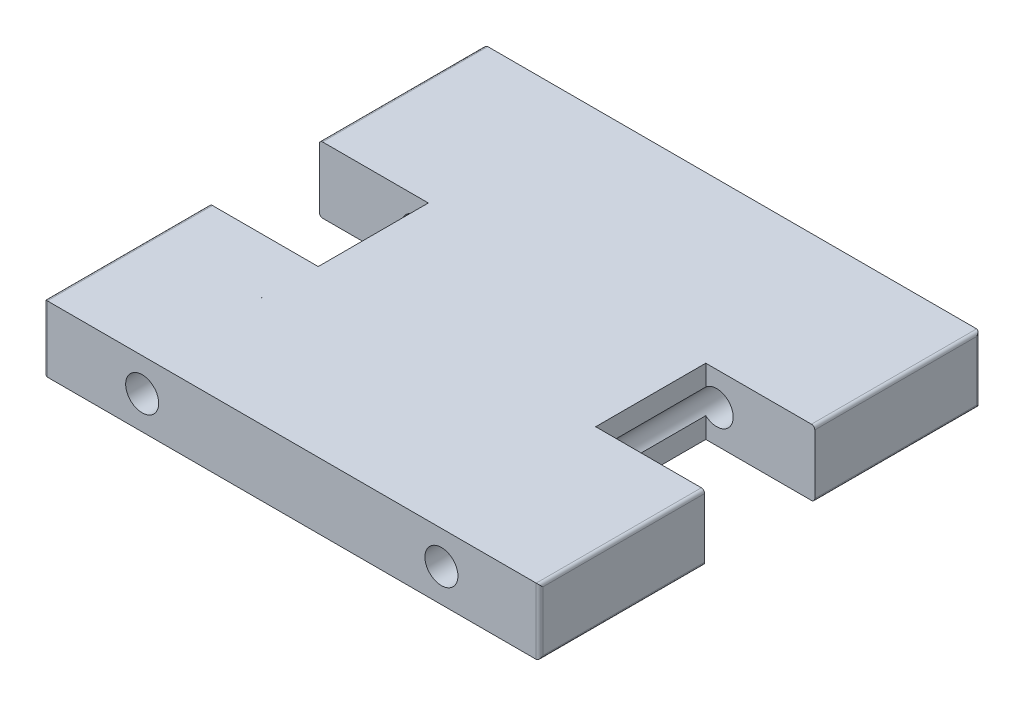
ISO-10303-21;
HEADER;
FILE_DESCRIPTION(('STEP AP214'),'2;1');
FILE_NAME('part.step','',(''),(''),'','','');
FILE_SCHEMA(('AUTOMOTIVE_DESIGN { 1 0 10303 214 1 1 1 1 }'));
ENDSEC;
DATA;
#1=APPLICATION_CONTEXT('core data for automotive mechanical design processes');
#2=APPLICATION_PROTOCOL_DEFINITION('international standard','automotive_design',2000,#1);
#3=PRODUCT_CONTEXT('',#1,'mechanical');
#4=PRODUCT('Part','Part','',(#3));
#5=PRODUCT_RELATED_PRODUCT_CATEGORY('part','',(#4));
#6=PRODUCT_DEFINITION_FORMATION('','',#4);
#7=PRODUCT_DEFINITION_CONTEXT('part definition',#1,'design');
#8=PRODUCT_DEFINITION('design','',#6,#7);
#9=PRODUCT_DEFINITION_SHAPE('','',#8);
#10=(LENGTH_UNIT() NAMED_UNIT(*) SI_UNIT(.MILLI.,.METRE.));
#11=(NAMED_UNIT(*) PLANE_ANGLE_UNIT() SI_UNIT($,.RADIAN.));
#12=(NAMED_UNIT(*) SI_UNIT($,.STERADIAN.) SOLID_ANGLE_UNIT());
#13=UNCERTAINTY_MEASURE_WITH_UNIT(LENGTH_MEASURE(1.E-05),#10,'distance_accuracy_value','');
#14=(GEOMETRIC_REPRESENTATION_CONTEXT(3) GLOBAL_UNCERTAINTY_ASSIGNED_CONTEXT((#13)) GLOBAL_UNIT_ASSIGNED_CONTEXT((#10,
#11,#12)) REPRESENTATION_CONTEXT('',''));
#15=CARTESIAN_POINT('',(0.,0.,0.));
#16=DIRECTION('',(0.,0.,1.));
#17=DIRECTION('',(1.,0.,0.));
#18=AXIS2_PLACEMENT_3D('',#15,#16,#17);
#19=CARTESIAN_POINT('',(0.,60.,-3.00000000000002));
#20=DIRECTION('',(1.,0.,0.));
#21=DIRECTION('',(0.,0.,-1.));
#22=AXIS2_PLACEMENT_3D('',#19,#20,#21);
#23=PLANE('',#22);
#24=DIRECTION('',(0.,1.,0.));
#25=VECTOR('',#24,1.);
#26=CARTESIAN_POINT('',(0.,60.,-150.));
#27=LINE('',#26,#25);
#28=CARTESIAN_POINT('',(0.,3.,-150.));
#29=VERTEX_POINT('',#28);
#30=CARTESIAN_POINT('',(0.,56.9999999999999,-150.));
#31=VERTEX_POINT('',#30);
#32=EDGE_CURVE('E312',#29,#31,#27,.T.);
#33=ORIENTED_EDGE('',*,*,#32,.F.);
#34=DIRECTION('',(0.,0.,1.));
#35=VECTOR('',#34,1.);
#36=CARTESIAN_POINT('',(0.,3.00000000000002,-400.));
#37=LINE('',#36,#35);
#38=CARTESIAN_POINT('',(0.,3.00000000000002,-3.));
#39=VERTEX_POINT('',#38);
#40=EDGE_CURVE('E323',#29,#39,#37,.T.);
#41=ORIENTED_EDGE('',*,*,#40,.T.);
#42=DIRECTION('',(0.,-1.,0.));
#43=VECTOR('',#42,1.);
#44=CARTESIAN_POINT('',(0.,60.,-3.00000000000002));
#45=LINE('',#44,#43);
#46=CARTESIAN_POINT('',(0.,56.9999999999999,-3.));
#47=VERTEX_POINT('',#46);
#48=EDGE_CURVE('E473',#47,#39,#45,.T.);
#49=ORIENTED_EDGE('',*,*,#48,.F.);
#50=DIRECTION('',(0.,0.,1.));
#51=VECTOR('',#50,1.);
#52=CARTESIAN_POINT('',(0.,56.9999999999999,-400.));
#53=LINE('',#52,#51);
#54=EDGE_CURVE('E324',#31,#47,#53,.T.);
#55=ORIENTED_EDGE('',*,*,#54,.F.);
#56=EDGE_LOOP('',(#33,#41,#49,#55));
#57=FACE_BOUND('',#56,.T.);
#58=ADVANCED_FACE('F40',(#57),#23,.F.);
#59=DIRECTION('',(0.,-1.,0.));
#60=VECTOR('',#59,1.);
#61=CARTESIAN_POINT('',(0.,60.,-250.));
#62=LINE('',#61,#60);
#63=CARTESIAN_POINT('',(0.,56.9999999999999,-250.));
#64=VERTEX_POINT('',#63);
#65=CARTESIAN_POINT('',(0.,3.,-250.));
#66=VERTEX_POINT('',#65);
#67=EDGE_CURVE('E295',#64,#66,#62,.T.);
#68=ORIENTED_EDGE('',*,*,#67,.F.);
#69=CARTESIAN_POINT('',(0.,56.9999999999999,-397.));
#70=VERTEX_POINT('',#69);
#71=EDGE_CURVE('E319',#70,#64,#53,.T.);
#72=ORIENTED_EDGE('',*,*,#71,.F.);
#73=DIRECTION('',(0.,-1.,0.));
#74=VECTOR('',#73,1.);
#75=CARTESIAN_POINT('',(0.,60.,-397.));
#76=LINE('',#75,#74);
#77=CARTESIAN_POINT('',(0.,3.00000000000002,-397.));
#78=VERTEX_POINT('',#77);
#79=EDGE_CURVE('E477',#70,#78,#76,.T.);
#80=ORIENTED_EDGE('',*,*,#79,.T.);
#81=EDGE_CURVE('E325',#78,#66,#37,.T.);
#82=ORIENTED_EDGE('',*,*,#81,.T.);
#83=EDGE_LOOP('',(#68,#72,#80,#82));
#84=FACE_BOUND('',#83,.T.);
#85=ADVANCED_FACE('F526',(#84),#23,.F.);
#86=CARTESIAN_POINT('',(450.,60.,-3.));
#87=DIRECTION('',(-1.,0.,0.));
#88=DIRECTION('',(0.,0.,1.));
#89=AXIS2_PLACEMENT_3D('',#86,#87,#88);
#90=PLANE('',#89);
#91=DIRECTION('',(0.,-1.,0.));
#92=VECTOR('',#91,1.);
#93=CARTESIAN_POINT('',(450.,60.,-150.));
#94=LINE('',#93,#92);
#95=CARTESIAN_POINT('',(450.,57.,-150.));
#96=VERTEX_POINT('',#95);
#97=CARTESIAN_POINT('',(450.,3.,-150.));
#98=VERTEX_POINT('',#97);
#99=EDGE_CURVE('E280',#96,#98,#94,.T.);
#100=ORIENTED_EDGE('',*,*,#99,.F.);
#101=DIRECTION('',(0.,0.,1.));
#102=VECTOR('',#101,1.);
#103=CARTESIAN_POINT('',(450.,57.,-400.));
#104=LINE('',#103,#102);
#105=CARTESIAN_POINT('',(450.,57.,-3.));
#106=VERTEX_POINT('',#105);
#107=EDGE_CURVE('E436',#96,#106,#104,.T.);
#108=ORIENTED_EDGE('',*,*,#107,.T.);
#109=DIRECTION('',(0.,-1.,0.));
#110=VECTOR('',#109,1.);
#111=CARTESIAN_POINT('',(450.,60.,-3.));
#112=LINE('',#111,#110);
#113=CARTESIAN_POINT('',(450.,3.,-3.));
#114=VERTEX_POINT('',#113);
#115=EDGE_CURVE('E466',#106,#114,#112,.T.);
#116=ORIENTED_EDGE('',*,*,#115,.T.);
#117=DIRECTION('',(0.,0.,1.));
#118=VECTOR('',#117,1.);
#119=CARTESIAN_POINT('',(450.,3.,-400.));
#120=LINE('',#119,#118);
#121=EDGE_CURVE('E446',#98,#114,#120,.T.);
#122=ORIENTED_EDGE('',*,*,#121,.F.);
#123=EDGE_LOOP('',(#100,#108,#116,#122));
#124=FACE_BOUND('',#123,.T.);
#125=ADVANCED_FACE('F532',(#124),#90,.F.);
#126=DIRECTION('',(0.,1.,0.));
#127=VECTOR('',#126,1.);
#128=CARTESIAN_POINT('',(450.,60.,-250.));
#129=LINE('',#128,#127);
#130=CARTESIAN_POINT('',(450.,3.,-250.));
#131=VERTEX_POINT('',#130);
#132=CARTESIAN_POINT('',(450.,57.,-250.));
#133=VERTEX_POINT('',#132);
#134=EDGE_CURVE('E67',#131,#133,#129,.T.);
#135=ORIENTED_EDGE('',*,*,#134,.F.);
#136=CARTESIAN_POINT('',(450.,3.,-397.));
#137=VERTEX_POINT('',#136);
#138=EDGE_CURVE('E331',#137,#131,#120,.T.);
#139=ORIENTED_EDGE('',*,*,#138,.F.);
#140=DIRECTION('',(0.,-1.,0.));
#141=VECTOR('',#140,1.);
#142=CARTESIAN_POINT('',(450.,60.,-397.));
#143=LINE('',#142,#141);
#144=CARTESIAN_POINT('',(450.,57.,-397.));
#145=VERTEX_POINT('',#144);
#146=EDGE_CURVE('E368',#145,#137,#143,.T.);
#147=ORIENTED_EDGE('',*,*,#146,.F.);
#148=EDGE_CURVE('E433',#145,#133,#104,.T.);
#149=ORIENTED_EDGE('',*,*,#148,.T.);
#150=EDGE_LOOP('',(#135,#139,#147,#149));
#151=FACE_BOUND('',#150,.T.);
#152=ADVANCED_FACE('F596',(#151),#90,.F.);
#153=CARTESIAN_POINT('',(447.,60.,-397.));
#154=DIRECTION('',(0.,-1.,0.));
#155=DIRECTION('',(0.,0.,-1.));
#156=AXIS2_PLACEMENT_3D('',#153,#154,#155);
#157=PLANE('',#156);
#158=DIRECTION('',(1.,0.,0.));
#159=VECTOR('',#158,1.);
#160=CARTESIAN_POINT('',(447.,60.,-150.));
#161=LINE('',#160,#159);
#162=CARTESIAN_POINT('',(3.,59.9999999999999,-150.));
#163=VERTEX_POINT('',#162);
#164=CARTESIAN_POINT('',(99.,60.,-150.));
#165=VERTEX_POINT('',#164);
#166=EDGE_CURVE('E309',#163,#165,#161,.T.);
#167=ORIENTED_EDGE('',*,*,#166,.F.);
#168=DIRECTION('',(0.,0.,1.));
#169=VECTOR('',#168,1.);
#170=CARTESIAN_POINT('',(3.,60.,-400.));
#171=LINE('',#170,#169);
#172=CARTESIAN_POINT('',(3.00000000000001,60.,0.));
#173=VERTEX_POINT('',#172);
#174=EDGE_CURVE('E400',#163,#173,#171,.T.);
#175=ORIENTED_EDGE('',*,*,#174,.T.);
#176=DIRECTION('',(1.,0.,0.));
#177=VECTOR('',#176,1.);
#178=CARTESIAN_POINT('',(447.,60.,0.));
#179=LINE('',#178,#177);
#180=CARTESIAN_POINT('',(447.,60.,0.));
#181=VERTEX_POINT('',#180);
#182=EDGE_CURVE('E364',#173,#181,#179,.T.);
#183=ORIENTED_EDGE('',*,*,#182,.T.);
#184=DIRECTION('',(0.,0.,1.));
#185=VECTOR('',#184,1.);
#186=CARTESIAN_POINT('',(447.,59.9999999999999,-400.));
#187=LINE('',#186,#185);
#188=CARTESIAN_POINT('',(447.,60.,-150.));
#189=VERTEX_POINT('',#188);
#190=EDGE_CURVE('E318',#189,#181,#187,.T.);
#191=ORIENTED_EDGE('',*,*,#190,.F.);
#192=DIRECTION('',(1.,0.,0.));
#193=VECTOR('',#192,1.);
#194=CARTESIAN_POINT('',(447.,60.,-150.));
#195=LINE('',#194,#193);
#196=CARTESIAN_POINT('',(351.,60.,-150.));
#197=VERTEX_POINT('',#196);
#198=EDGE_CURVE('E277',#197,#189,#195,.T.);
#199=ORIENTED_EDGE('',*,*,#198,.F.);
#200=DIRECTION('',(0.,0.,1.));
#201=VECTOR('',#200,1.);
#202=CARTESIAN_POINT('',(351.,60.,-397.));
#203=LINE('',#202,#201);
#204=CARTESIAN_POINT('',(351.,60.,-250.));
#205=VERTEX_POINT('',#204);
#206=EDGE_CURVE('E287',#205,#197,#203,.T.);
#207=ORIENTED_EDGE('',*,*,#206,.F.);
#208=DIRECTION('',(-1.,0.,0.));
#209=VECTOR('',#208,1.);
#210=CARTESIAN_POINT('',(447.,60.,-250.));
#211=LINE('',#210,#209);
#212=CARTESIAN_POINT('',(447.,60.,-250.));
#213=VERTEX_POINT('',#212);
#214=EDGE_CURVE('E264',#213,#205,#211,.T.);
#215=ORIENTED_EDGE('',*,*,#214,.F.);
#216=CARTESIAN_POINT('',(447.,60.,-400.));
#217=VERTEX_POINT('',#216);
#218=EDGE_CURVE('E396',#217,#213,#187,.T.);
#219=ORIENTED_EDGE('',*,*,#218,.F.);
#220=DIRECTION('',(-1.,0.,0.));
#221=VECTOR('',#220,1.);
#222=CARTESIAN_POINT('',(3.,60.,-400.));
#223=LINE('',#222,#221);
#224=CARTESIAN_POINT('',(3.,60.,-400.));
#225=VERTEX_POINT('',#224);
#226=EDGE_CURVE('E369',#217,#225,#223,.T.);
#227=ORIENTED_EDGE('',*,*,#226,.T.);
#228=CARTESIAN_POINT('',(3.,60.,-250.));
#229=VERTEX_POINT('',#228);
#230=EDGE_CURVE('E407',#225,#229,#171,.T.);
#231=ORIENTED_EDGE('',*,*,#230,.T.);
#232=DIRECTION('',(-1.,0.,0.));
#233=VECTOR('',#232,1.);
#234=CARTESIAN_POINT('',(447.,60.,-250.));
#235=LINE('',#234,#233);
#236=CARTESIAN_POINT('',(99.,60.,-250.));
#237=VERTEX_POINT('',#236);
#238=EDGE_CURVE('E59',#237,#229,#235,.T.);
#239=ORIENTED_EDGE('',*,*,#238,.F.);
#240=DIRECTION('',(0.,0.,-1.));
#241=VECTOR('',#240,1.);
#242=CARTESIAN_POINT('',(99.,60.,-397.));
#243=LINE('',#242,#241);
#244=EDGE_CURVE('E302',#165,#237,#243,.T.);
#245=ORIENTED_EDGE('',*,*,#244,.F.);
#246=EDGE_LOOP('',(#167,#175,#183,#191,#199,#207,#215,#219,#227,#231,#239,#245));
#247=FACE_BOUND('',#246,.T.);
#248=ADVANCED_FACE('F568',(#247),#157,.F.);
#249=CARTESIAN_POINT('',(447.,0.,-397.));
#250=DIRECTION('',(0.,-1.,0.));
#251=DIRECTION('',(0.,0.,-1.));
#252=AXIS2_PLACEMENT_3D('',#249,#250,#251);
#253=PLANE('',#252);
#254=DIRECTION('',(0.,0.,1.));
#255=VECTOR('',#254,1.);
#256=CARTESIAN_POINT('',(3.00000000000002,0.,-400.));
#257=LINE('',#256,#255);
#258=CARTESIAN_POINT('',(3.,0.,-150.));
#259=VERTEX_POINT('',#258);
#260=CARTESIAN_POINT('',(3.,0.,1.19999999968419E-05));
#261=VERTEX_POINT('',#260);
#262=EDGE_CURVE('E44',#259,#261,#257,.T.);
#263=ORIENTED_EDGE('',*,*,#262,.F.);
#264=DIRECTION('',(1.,0.,0.));
#265=VECTOR('',#264,1.);
#266=CARTESIAN_POINT('',(-0.999999999999969,0.,-150.));
#267=LINE('',#266,#265);
#268=CARTESIAN_POINT('',(99.,0.,-150.));
#269=VERTEX_POINT('',#268);
#270=EDGE_CURVE('E208',#259,#269,#267,.T.);
#271=ORIENTED_EDGE('',*,*,#270,.T.);
#272=DIRECTION('',(0.,0.,-1.));
#273=VECTOR('',#272,1.);
#274=CARTESIAN_POINT('',(99.,0.,-250.));
#275=LINE('',#274,#273);
#276=CARTESIAN_POINT('',(99.,0.,-250.));
#277=VERTEX_POINT('',#276);
#278=EDGE_CURVE('E220',#269,#277,#275,.T.);
#279=ORIENTED_EDGE('',*,*,#278,.T.);
#280=DIRECTION('',(-1.,0.,0.));
#281=VECTOR('',#280,1.);
#282=CARTESIAN_POINT('',(-0.999999999999981,0.,-250.));
#283=LINE('',#282,#281);
#284=CARTESIAN_POINT('',(3.,0.,-250.));
#285=VERTEX_POINT('',#284);
#286=EDGE_CURVE('E227',#277,#285,#283,.T.);
#287=ORIENTED_EDGE('',*,*,#286,.T.);
#288=CARTESIAN_POINT('',(3.,0.,-400.));
#289=VERTEX_POINT('',#288);
#290=EDGE_CURVE('E340',#289,#285,#257,.T.);
#291=ORIENTED_EDGE('',*,*,#290,.F.);
#292=DIRECTION('',(-1.,0.,0.));
#293=VECTOR('',#292,1.);
#294=CARTESIAN_POINT('',(3.,0.,-400.));
#295=LINE('',#294,#293);
#296=CARTESIAN_POINT('',(447.,0.,-400.));
#297=VERTEX_POINT('',#296);
#298=EDGE_CURVE('E376',#297,#289,#295,.T.);
#299=ORIENTED_EDGE('',*,*,#298,.F.);
#300=DIRECTION('',(0.,0.,1.));
#301=VECTOR('',#300,1.);
#302=CARTESIAN_POINT('',(447.,0.,-400.));
#303=LINE('',#302,#301);
#304=CARTESIAN_POINT('',(447.,0.,-250.));
#305=VERTEX_POINT('',#304);
#306=EDGE_CURVE('E335',#297,#305,#303,.T.);
#307=ORIENTED_EDGE('',*,*,#306,.T.);
#308=DIRECTION('',(-1.,0.,0.));
#309=VECTOR('',#308,1.);
#310=CARTESIAN_POINT('',(351.,0.,-250.));
#311=LINE('',#310,#309);
#312=CARTESIAN_POINT('',(351.,0.,-250.));
#313=VERTEX_POINT('',#312);
#314=EDGE_CURVE('E252',#305,#313,#311,.T.);
#315=ORIENTED_EDGE('',*,*,#314,.T.);
#316=DIRECTION('',(0.,0.,1.));
#317=VECTOR('',#316,1.);
#318=CARTESIAN_POINT('',(351.,0.,-250.));
#319=LINE('',#318,#317);
#320=CARTESIAN_POINT('',(351.,0.,-150.));
#321=VERTEX_POINT('',#320);
#322=EDGE_CURVE('E244',#313,#321,#319,.T.);
#323=ORIENTED_EDGE('',*,*,#322,.T.);
#324=DIRECTION('',(1.,0.,0.));
#325=VECTOR('',#324,1.);
#326=CARTESIAN_POINT('',(351.,0.,-150.));
#327=LINE('',#326,#325);
#328=CARTESIAN_POINT('',(447.,0.,-150.));
#329=VERTEX_POINT('',#328);
#330=EDGE_CURVE('E248',#321,#329,#327,.T.);
#331=ORIENTED_EDGE('',*,*,#330,.T.);
#332=CARTESIAN_POINT('',(447.,0.,0.));
#333=VERTEX_POINT('',#332);
#334=EDGE_CURVE('E338',#329,#333,#303,.T.);
#335=ORIENTED_EDGE('',*,*,#334,.T.);
#336=DIRECTION('',(1.,0.,0.));
#337=VECTOR('',#336,1.);
#338=CARTESIAN_POINT('',(3.00000000000002,0.,0.));
#339=LINE('',#338,#337);
#340=EDGE_CURVE('E372',#261,#333,#339,.T.);
#341=ORIENTED_EDGE('',*,*,#340,.F.);
#342=EDGE_LOOP('',(#263,#271,#279,#287,#291,#299,#307,#315,#323,#331,#335,#341));
#343=FACE_BOUND('',#342,.T.);
#344=ADVANCED_FACE('F230',(#343),#253,.T.);
#345=CARTESIAN_POINT('',(3.,3.,-400.));
#346=DIRECTION('',(0.,0.,1.));
#347=DIRECTION('',(1.,0.,0.));
#348=AXIS2_PLACEMENT_3D('',#345,#346,#347);
#349=CYLINDRICAL_SURFACE('',#348,3.);
#350=ORIENTED_EDGE('',*,*,#40,.F.);
#351=CARTESIAN_POINT('',(3.,3.,-150.));
#352=DIRECTION('',(0.,0.,-1.));
#353=DIRECTION('',(-1.,0.,0.));
#354=AXIS2_PLACEMENT_3D('',#351,#352,#353);
#355=CIRCLE('',#354,3.);
#356=EDGE_CURVE('E315',#29,#259,#355,.F.);
#357=ORIENTED_EDGE('',*,*,#356,.T.);
#358=ORIENTED_EDGE('',*,*,#262,.T.);
#359=CARTESIAN_POINT('',(3.,3.,-3.));
#360=DIRECTION('',(0.,-0.707106781186547,-0.707106781186547));
#361=DIRECTION('',(0.,-0.707106781186547,0.707106781186547));
#362=AXIS2_PLACEMENT_3D('',#359,#360,#361);
#363=ELLIPSE('',#362,4.24264068711928,3.);
#364=EDGE_CURVE('E415',#261,#39,#363,.T.);
#365=ORIENTED_EDGE('',*,*,#364,.T.);
#366=EDGE_LOOP('',(#350,#357,#358,#365));
#367=FACE_BOUND('',#366,.T.);
#368=ADVANCED_FACE('F521',(#367),#349,.T.);
#369=ORIENTED_EDGE('',*,*,#290,.T.);
#370=CARTESIAN_POINT('',(3.,3.,-250.));
#371=DIRECTION('',(0.,0.,1.));
#372=DIRECTION('',(1.,0.,0.));
#373=AXIS2_PLACEMENT_3D('',#370,#371,#372);
#374=CIRCLE('',#373,3.);
#375=EDGE_CURVE('E298',#285,#66,#374,.F.);
#376=ORIENTED_EDGE('',*,*,#375,.T.);
#377=ORIENTED_EDGE('',*,*,#81,.F.);
#378=CARTESIAN_POINT('',(3.,3.,-397.));
#379=DIRECTION('',(0.,-0.707106781186547,0.707106781186547));
#380=DIRECTION('',(0.,-0.707106781186547,-0.707106781186547));
#381=AXIS2_PLACEMENT_3D('',#378,#379,#380);
#382=ELLIPSE('',#381,4.24264068711929,3.);
#383=EDGE_CURVE('E386',#78,#289,#382,.T.);
#384=ORIENTED_EDGE('',*,*,#383,.T.);
#385=EDGE_LOOP('',(#369,#376,#377,#384));
#386=FACE_BOUND('',#385,.T.);
#387=ADVANCED_FACE('F514',(#386),#349,.T.);
#388=CARTESIAN_POINT('',(447.,3.,-400.));
#389=DIRECTION('',(0.,0.,1.));
#390=DIRECTION('',(1.,0.,0.));
#391=AXIS2_PLACEMENT_3D('',#388,#389,#390);
#392=CYLINDRICAL_SURFACE('',#391,2.99999999999998);
#393=ORIENTED_EDGE('',*,*,#334,.F.);
#394=CARTESIAN_POINT('',(447.,3.,-150.));
#395=DIRECTION('',(0.,0.,-1.));
#396=DIRECTION('',(-1.,0.,0.));
#397=AXIS2_PLACEMENT_3D('',#394,#395,#396);
#398=CIRCLE('',#397,2.99999999999998);
#399=EDGE_CURVE('E283',#329,#98,#398,.F.);
#400=ORIENTED_EDGE('',*,*,#399,.T.);
#401=ORIENTED_EDGE('',*,*,#121,.T.);
#402=CARTESIAN_POINT('',(447.,3.,-3.));
#403=DIRECTION('',(0.,-0.707106781186547,-0.707106781186547));
#404=DIRECTION('',(0.,-0.707106781186547,0.707106781186547));
#405=AXIS2_PLACEMENT_3D('',#402,#403,#404);
#406=ELLIPSE('',#405,4.24264068711927,2.99999999999999);
#407=EDGE_CURVE('E381',#114,#333,#406,.T.);
#408=ORIENTED_EDGE('',*,*,#407,.T.);
#409=EDGE_LOOP('',(#393,#400,#401,#408));
#410=FACE_BOUND('',#409,.T.);
#411=ADVANCED_FACE('F512',(#410),#392,.T.);
#412=ORIENTED_EDGE('',*,*,#138,.T.);
#413=CARTESIAN_POINT('',(447.,3.,-250.));
#414=DIRECTION('',(0.,0.,1.));
#415=DIRECTION('',(1.,0.,0.));
#416=AXIS2_PLACEMENT_3D('',#413,#414,#415);
#417=CIRCLE('',#416,2.99999999999998);
#418=EDGE_CURVE('E269',#131,#305,#417,.F.);
#419=ORIENTED_EDGE('',*,*,#418,.T.);
#420=ORIENTED_EDGE('',*,*,#306,.F.);
#421=CARTESIAN_POINT('',(447.,3.,-397.));
#422=DIRECTION('',(0.,-0.707106781186547,0.707106781186547));
#423=DIRECTION('',(0.,-0.707106781186547,-0.707106781186547));
#424=AXIS2_PLACEMENT_3D('',#421,#422,#423);
#425=ELLIPSE('',#424,4.24264068711927,2.99999999999999);
#426=EDGE_CURVE('E385',#297,#137,#425,.T.);
#427=ORIENTED_EDGE('',*,*,#426,.T.);
#428=EDGE_LOOP('',(#412,#419,#420,#427));
#429=FACE_BOUND('',#428,.T.);
#430=ADVANCED_FACE('F460',(#429),#392,.T.);
#431=CARTESIAN_POINT('',(3.,56.9999999999999,-400.));
#432=DIRECTION('',(0.,0.,1.));
#433=DIRECTION('',(1.,0.,0.));
#434=AXIS2_PLACEMENT_3D('',#431,#432,#433);
#435=CYLINDRICAL_SURFACE('',#434,2.99999999999999);
#436=ORIENTED_EDGE('',*,*,#174,.F.);
#437=CARTESIAN_POINT('',(3.,56.9999999999999,-150.));
#438=DIRECTION('',(0.,0.,-1.));
#439=DIRECTION('',(-1.,0.,0.));
#440=AXIS2_PLACEMENT_3D('',#437,#438,#439);
#441=CIRCLE('',#440,2.99999999999999);
#442=EDGE_CURVE('E305',#163,#31,#441,.F.);
#443=ORIENTED_EDGE('',*,*,#442,.T.);
#444=ORIENTED_EDGE('',*,*,#54,.T.);
#445=CARTESIAN_POINT('',(3.,56.9999999999999,-3.));
#446=DIRECTION('',(0.,-0.707106781186547,0.707106781186547));
#447=DIRECTION('',(0.,-0.707106781186547,-0.707106781186547));
#448=AXIS2_PLACEMENT_3D('',#445,#446,#447);
#449=ELLIPSE('',#448,4.24264068711928,3.);
#450=EDGE_CURVE('E403',#47,#173,#449,.F.);
#451=ORIENTED_EDGE('',*,*,#450,.T.);
#452=EDGE_LOOP('',(#436,#443,#444,#451));
#453=FACE_BOUND('',#452,.T.);
#454=ADVANCED_FACE('F520',(#453),#435,.T.);
#455=ORIENTED_EDGE('',*,*,#71,.T.);
#456=CARTESIAN_POINT('',(3.,56.9999999999999,-250.));
#457=DIRECTION('',(0.,0.,1.));
#458=DIRECTION('',(1.,0.,0.));
#459=AXIS2_PLACEMENT_3D('',#456,#457,#458);
#460=CIRCLE('',#459,2.99999999999999);
#461=EDGE_CURVE('E290',#64,#229,#460,.F.);
#462=ORIENTED_EDGE('',*,*,#461,.T.);
#463=ORIENTED_EDGE('',*,*,#230,.F.);
#464=CARTESIAN_POINT('',(3.,56.9999999999999,-397.));
#465=DIRECTION('',(0.,-0.707106781186547,-0.707106781186547));
#466=DIRECTION('',(0.,-0.707106781186547,0.707106781186547));
#467=AXIS2_PLACEMENT_3D('',#464,#465,#466);
#468=ELLIPSE('',#467,4.24264068711928,3.);
#469=EDGE_CURVE('E395',#225,#70,#468,.F.);
#470=ORIENTED_EDGE('',*,*,#469,.T.);
#471=EDGE_LOOP('',(#455,#462,#463,#470));
#472=FACE_BOUND('',#471,.T.);
#473=ADVANCED_FACE('F616',(#472),#435,.T.);
#474=CARTESIAN_POINT('',(447.,57.,-400.));
#475=DIRECTION('',(0.,0.,1.));
#476=DIRECTION('',(1.,0.,0.));
#477=AXIS2_PLACEMENT_3D('',#474,#475,#476);
#478=CYLINDRICAL_SURFACE('',#477,2.99999999999998);
#479=ORIENTED_EDGE('',*,*,#107,.F.);
#480=CARTESIAN_POINT('',(447.,57.,-150.));
#481=DIRECTION('',(0.,0.,-1.));
#482=DIRECTION('',(-1.,0.,0.));
#483=AXIS2_PLACEMENT_3D('',#480,#481,#482);
#484=CIRCLE('',#483,2.99999999999998);
#485=EDGE_CURVE('E273',#96,#189,#484,.F.);
#486=ORIENTED_EDGE('',*,*,#485,.T.);
#487=ORIENTED_EDGE('',*,*,#190,.T.);
#488=CARTESIAN_POINT('',(447.,57.,-3.));
#489=DIRECTION('',(0.,-0.707106781186547,0.707106781186547));
#490=DIRECTION('',(0.,-0.707106781186547,-0.707106781186547));
#491=AXIS2_PLACEMENT_3D('',#488,#489,#490);
#492=ELLIPSE('',#491,4.24264068711927,2.99999999999999);
#493=EDGE_CURVE('E391',#181,#106,#492,.F.);
#494=ORIENTED_EDGE('',*,*,#493,.T.);
#495=EDGE_LOOP('',(#479,#486,#487,#494));
#496=FACE_BOUND('',#495,.T.);
#497=ADVANCED_FACE('F586',(#496),#478,.T.);
#498=ORIENTED_EDGE('',*,*,#218,.T.);
#499=CARTESIAN_POINT('',(447.,57.,-250.));
#500=DIRECTION('',(0.,0.,1.));
#501=DIRECTION('',(1.,0.,0.));
#502=AXIS2_PLACEMENT_3D('',#499,#500,#501);
#503=CIRCLE('',#502,2.99999999999998);
#504=EDGE_CURVE('E261',#213,#133,#503,.F.);
#505=ORIENTED_EDGE('',*,*,#504,.T.);
#506=ORIENTED_EDGE('',*,*,#148,.F.);
#507=CARTESIAN_POINT('',(447.,57.,-397.));
#508=DIRECTION('',(0.,-0.707106781186547,-0.707106781186547));
#509=DIRECTION('',(0.,-0.707106781186547,0.707106781186547));
#510=AXIS2_PLACEMENT_3D('',#507,#508,#509);
#511=ELLIPSE('',#510,4.24264068711927,2.99999999999999);
#512=EDGE_CURVE('E387',#145,#217,#511,.F.);
#513=ORIENTED_EDGE('',*,*,#512,.T.);
#514=EDGE_LOOP('',(#498,#505,#506,#513));
#515=FACE_BOUND('',#514,.T.);
#516=ADVANCED_FACE('F573',(#515),#478,.T.);
#517=CARTESIAN_POINT('',(89.1,30.,-400.));
#518=DIRECTION('',(0.,0.,1.));
#519=DIRECTION('',(1.,0.,0.));
#520=AXIS2_PLACEMENT_3D('',#517,#518,#519);
#521=CYLINDRICAL_SURFACE('',#520,15.);
#522=CARTESIAN_POINT('',(89.1,30.,0.));
#523=DIRECTION('',(0.,0.,-1.));
#524=DIRECTION('',(-1.,0.,0.));
#525=AXIS2_PLACEMENT_3D('',#522,#523,#524);
#526=CIRCLE('',#525,15.);
#527=CARTESIAN_POINT('',(74.1,30.,0.));
#528=VERTEX_POINT('',#527);
#529=EDGE_CURVE('E390',#528,#528,#526,.T.);
#530=ORIENTED_EDGE('',*,*,#529,.F.);
#531=EDGE_LOOP('',(#530));
#532=FACE_BOUND('',#531,.T.);
#533=CARTESIAN_POINT('',(89.1,30.,-400.));
#534=DIRECTION('',(0.,0.,1.));
#535=DIRECTION('',(1.,0.,0.));
#536=AXIS2_PLACEMENT_3D('',#533,#534,#535);
#537=CIRCLE('',#536,15.);
#538=CARTESIAN_POINT('',(104.1,30.,-400.));
#539=VERTEX_POINT('',#538);
#540=EDGE_CURVE('E420',#539,#539,#537,.T.);
#541=ORIENTED_EDGE('',*,*,#540,.F.);
#542=EDGE_LOOP('',(#541));
#543=FACE_BOUND('',#542,.T.);
#544=CARTESIAN_POINT('',(89.1,30.,-150.));
#545=DIRECTION('',(0.,0.,-1.));
#546=DIRECTION('',(-1.,0.,0.));
#547=AXIS2_PLACEMENT_3D('',#544,#545,#546);
#548=CIRCLE('',#547,15.);
#549=CARTESIAN_POINT('',(99.,41.2689839825958,-150.));
#550=VERTEX_POINT('',#549);
#551=CARTESIAN_POINT('',(99.,18.7310160174042,-150.));
#552=VERTEX_POINT('',#551);
#553=EDGE_CURVE('E12',#550,#552,#548,.F.);
#554=ORIENTED_EDGE('',*,*,#553,.F.);
#555=DIRECTION('',(0.,0.,1.));
#556=VECTOR('',#555,1.);
#557=CARTESIAN_POINT('',(99.,41.2689839825958,-400.));
#558=LINE('',#557,#556);
#559=CARTESIAN_POINT('',(99.,41.2689839825958,-250.));
#560=VERTEX_POINT('',#559);
#561=EDGE_CURVE('E344',#560,#550,#558,.T.);
#562=ORIENTED_EDGE('',*,*,#561,.F.);
#563=CARTESIAN_POINT('',(89.1,30.,-250.));
#564=DIRECTION('',(0.,0.,1.));
#565=DIRECTION('',(1.,0.,0.));
#566=AXIS2_PLACEMENT_3D('',#563,#564,#565);
#567=CIRCLE('',#566,15.);
#568=CARTESIAN_POINT('',(99.,18.7310160174042,-250.));
#569=VERTEX_POINT('',#568);
#570=EDGE_CURVE('E347',#569,#560,#567,.F.);
#571=ORIENTED_EDGE('',*,*,#570,.F.);
#572=DIRECTION('',(0.,0.,1.));
#573=VECTOR('',#572,1.);
#574=CARTESIAN_POINT('',(99.,18.7310160174042,-400.));
#575=LINE('',#574,#573);
#576=EDGE_CURVE('E51',#552,#569,#575,.F.);
#577=ORIENTED_EDGE('',*,*,#576,.F.);
#578=EDGE_LOOP('',(#554,#562,#571,#577));
#579=FACE_BOUND('',#578,.T.);
#580=ADVANCED_FACE('F607',(#532,#543,#579),#521,.F.);
#581=CARTESIAN_POINT('',(360.9,30.,-400.));
#582=DIRECTION('',(0.,0.,1.));
#583=DIRECTION('',(1.,0.,0.));
#584=AXIS2_PLACEMENT_3D('',#581,#582,#583);
#585=CYLINDRICAL_SURFACE('',#584,15.);
#586=CARTESIAN_POINT('',(360.9,30.,0.));
#587=DIRECTION('',(0.,0.,-1.));
#588=DIRECTION('',(-1.,0.,0.));
#589=AXIS2_PLACEMENT_3D('',#586,#587,#588);
#590=CIRCLE('',#589,15.);
#591=CARTESIAN_POINT('',(345.9,30.,0.));
#592=VERTEX_POINT('',#591);
#593=EDGE_CURVE('E491',#592,#592,#590,.T.);
#594=ORIENTED_EDGE('',*,*,#593,.F.);
#595=EDGE_LOOP('',(#594));
#596=FACE_BOUND('',#595,.T.);
#597=CARTESIAN_POINT('',(360.9,30.,-400.));
#598=DIRECTION('',(0.,0.,1.));
#599=DIRECTION('',(1.,0.,0.));
#600=AXIS2_PLACEMENT_3D('',#597,#598,#599);
#601=CIRCLE('',#600,15.);
#602=CARTESIAN_POINT('',(375.9,30.,-400.));
#603=VERTEX_POINT('',#602);
#604=EDGE_CURVE('E430',#603,#603,#601,.T.);
#605=ORIENTED_EDGE('',*,*,#604,.F.);
#606=EDGE_LOOP('',(#605));
#607=FACE_BOUND('',#606,.T.);
#608=CARTESIAN_POINT('',(360.9,30.,-150.));
#609=DIRECTION('',(0.,0.,-1.));
#610=DIRECTION('',(-1.,0.,0.));
#611=AXIS2_PLACEMENT_3D('',#608,#609,#610);
#612=CIRCLE('',#611,15.);
#613=CARTESIAN_POINT('',(351.,18.7310160174043,-150.));
#614=VERTEX_POINT('',#613);
#615=CARTESIAN_POINT('',(351.,41.2689839825957,-150.));
#616=VERTEX_POINT('',#615);
#617=EDGE_CURVE('E350',#614,#616,#612,.F.);
#618=ORIENTED_EDGE('',*,*,#617,.F.);
#619=DIRECTION('',(0.,0.,1.));
#620=VECTOR('',#619,1.);
#621=CARTESIAN_POINT('',(351.,18.7310160174041,-400.));
#622=LINE('',#621,#620);
#623=CARTESIAN_POINT('',(351.,18.7310160174042,-250.));
#624=VERTEX_POINT('',#623);
#625=EDGE_CURVE('E357',#624,#614,#622,.T.);
#626=ORIENTED_EDGE('',*,*,#625,.F.);
#627=CARTESIAN_POINT('',(360.9,30.,-250.));
#628=DIRECTION('',(0.,0.,1.));
#629=DIRECTION('',(1.,0.,0.));
#630=AXIS2_PLACEMENT_3D('',#627,#628,#629);
#631=CIRCLE('',#630,15.);
#632=CARTESIAN_POINT('',(351.,41.2689839825958,-250.));
#633=VERTEX_POINT('',#632);
#634=EDGE_CURVE('E360',#633,#624,#631,.F.);
#635=ORIENTED_EDGE('',*,*,#634,.F.);
#636=DIRECTION('',(0.,0.,1.));
#637=VECTOR('',#636,1.);
#638=CARTESIAN_POINT('',(351.,41.2689839825959,-400.));
#639=LINE('',#638,#637);
#640=EDGE_CURVE('E353',#616,#633,#639,.F.);
#641=ORIENTED_EDGE('',*,*,#640,.F.);
#642=EDGE_LOOP('',(#618,#626,#635,#641));
#643=FACE_BOUND('',#642,.T.);
#644=ADVANCED_FACE('F595',(#596,#607,#643),#585,.F.);
#645=CARTESIAN_POINT('',(447.,60.,-397.));
#646=DIRECTION('',(0.,-1.,0.));
#647=DIRECTION('',(0.,0.,-1.));
#648=AXIS2_PLACEMENT_3D('',#645,#646,#647);
#649=CYLINDRICAL_SURFACE('',#648,3.);
#650=ORIENTED_EDGE('',*,*,#512,.F.);
#651=ORIENTED_EDGE('',*,*,#146,.T.);
#652=ORIENTED_EDGE('',*,*,#426,.F.);
#653=DIRECTION('',(0.,-1.,0.));
#654=VECTOR('',#653,1.);
#655=CARTESIAN_POINT('',(447.,60.,-400.));
#656=LINE('',#655,#654);
#657=EDGE_CURVE('E363',#217,#297,#656,.T.);
#658=ORIENTED_EDGE('',*,*,#657,.F.);
#659=EDGE_LOOP('',(#650,#651,#652,#658));
#660=FACE_BOUND('',#659,.T.);
#661=ADVANCED_FACE('F42',(#660),#649,.T.);
#662=CARTESIAN_POINT('',(3.,60.,-397.));
#663=DIRECTION('',(0.,-1.,0.));
#664=DIRECTION('',(0.,0.,-1.));
#665=AXIS2_PLACEMENT_3D('',#662,#663,#664);
#666=CYLINDRICAL_SURFACE('',#665,3.);
#667=ORIENTED_EDGE('',*,*,#383,.F.);
#668=ORIENTED_EDGE('',*,*,#79,.F.);
#669=ORIENTED_EDGE('',*,*,#469,.F.);
#670=DIRECTION('',(0.,-1.,0.));
#671=VECTOR('',#670,1.);
#672=CARTESIAN_POINT('',(3.,60.,-400.));
#673=LINE('',#672,#671);
#674=EDGE_CURVE('E482',#225,#289,#673,.T.);
#675=ORIENTED_EDGE('',*,*,#674,.T.);
#676=EDGE_LOOP('',(#667,#668,#669,#675));
#677=FACE_BOUND('',#676,.T.);
#678=ADVANCED_FACE('F539',(#677),#666,.T.);
#679=CARTESIAN_POINT('',(3.,60.,-3.));
#680=DIRECTION('',(0.,-1.,0.));
#681=DIRECTION('',(0.,0.,-1.));
#682=AXIS2_PLACEMENT_3D('',#679,#680,#681);
#683=CYLINDRICAL_SURFACE('',#682,3.);
#684=ORIENTED_EDGE('',*,*,#364,.F.);
#685=DIRECTION('',(0.,-1.,0.));
#686=VECTOR('',#685,1.);
#687=CARTESIAN_POINT('',(3.00000000000002,60.,0.));
#688=LINE('',#687,#686);
#689=EDGE_CURVE('E478',#173,#261,#688,.T.);
#690=ORIENTED_EDGE('',*,*,#689,.F.);
#691=ORIENTED_EDGE('',*,*,#450,.F.);
#692=ORIENTED_EDGE('',*,*,#48,.T.);
#693=EDGE_LOOP('',(#684,#690,#691,#692));
#694=FACE_BOUND('',#693,.T.);
#695=ADVANCED_FACE('F537',(#694),#683,.T.);
#696=CARTESIAN_POINT('',(447.,60.,-3.));
#697=DIRECTION('',(0.,-1.,0.));
#698=DIRECTION('',(0.,0.,-1.));
#699=AXIS2_PLACEMENT_3D('',#696,#697,#698);
#700=CYLINDRICAL_SURFACE('',#699,3.);
#701=ORIENTED_EDGE('',*,*,#493,.F.);
#702=DIRECTION('',(0.,-1.,0.));
#703=VECTOR('',#702,1.);
#704=CARTESIAN_POINT('',(447.,60.,0.));
#705=LINE('',#704,#703);
#706=EDGE_CURVE('E469',#181,#333,#705,.T.);
#707=ORIENTED_EDGE('',*,*,#706,.T.);
#708=ORIENTED_EDGE('',*,*,#407,.F.);
#709=ORIENTED_EDGE('',*,*,#115,.F.);
#710=EDGE_LOOP('',(#701,#707,#708,#709));
#711=FACE_BOUND('',#710,.T.);
#712=ADVANCED_FACE('F504',(#711),#700,.T.);
#713=CARTESIAN_POINT('',(3.,60.,-400.));
#714=DIRECTION('',(0.,0.,1.));
#715=DIRECTION('',(1.,0.,0.));
#716=AXIS2_PLACEMENT_3D('',#713,#714,#715);
#717=PLANE('',#716);
#718=ORIENTED_EDGE('',*,*,#604,.T.);
#719=EDGE_LOOP('',(#718));
#720=FACE_BOUND('',#719,.T.);
#721=ORIENTED_EDGE('',*,*,#540,.T.);
#722=EDGE_LOOP('',(#721));
#723=FACE_BOUND('',#722,.T.);
#724=ORIENTED_EDGE('',*,*,#298,.T.);
#725=ORIENTED_EDGE('',*,*,#674,.F.);
#726=ORIENTED_EDGE('',*,*,#226,.F.);
#727=ORIENTED_EDGE('',*,*,#657,.T.);
#728=EDGE_LOOP('',(#724,#725,#726,#727));
#729=FACE_BOUND('',#728,.T.);
#730=ADVANCED_FACE('F542',(#720,#723,#729),#717,.F.);
#731=CARTESIAN_POINT('',(3.00000000000002,60.,0.));
#732=DIRECTION('',(0.,0.,-1.));
#733=DIRECTION('',(-1.,0.,0.));
#734=AXIS2_PLACEMENT_3D('',#731,#732,#733);
#735=PLANE('',#734);
#736=ORIENTED_EDGE('',*,*,#593,.T.);
#737=EDGE_LOOP('',(#736));
#738=FACE_BOUND('',#737,.T.);
#739=ORIENTED_EDGE('',*,*,#529,.T.);
#740=EDGE_LOOP('',(#739));
#741=FACE_BOUND('',#740,.T.);
#742=ORIENTED_EDGE('',*,*,#340,.T.);
#743=ORIENTED_EDGE('',*,*,#706,.F.);
#744=ORIENTED_EDGE('',*,*,#182,.F.);
#745=ORIENTED_EDGE('',*,*,#689,.T.);
#746=EDGE_LOOP('',(#742,#743,#744,#745));
#747=FACE_BOUND('',#746,.T.);
#748=ADVANCED_FACE('F508',(#738,#741,#747),#735,.F.);
#749=CARTESIAN_POINT('',(351.,60.000025,-250.));
#750=DIRECTION('',(1.,0.,0.));
#751=DIRECTION('',(0.,0.,-1.));
#752=AXIS2_PLACEMENT_3D('',#749,#750,#751);
#753=PLANE('',#752);
#754=ORIENTED_EDGE('',*,*,#206,.T.);
#755=DIRECTION('',(0.,-1.,0.));
#756=VECTOR('',#755,1.);
#757=CARTESIAN_POINT('',(351.,60.000025,-150.));
#758=LINE('',#757,#756);
#759=EDGE_CURVE('E233',#197,#616,#758,.T.);
#760=ORIENTED_EDGE('',*,*,#759,.T.);
#761=ORIENTED_EDGE('',*,*,#640,.T.);
#762=DIRECTION('',(0.,-1.,0.));
#763=VECTOR('',#762,1.);
#764=CARTESIAN_POINT('',(351.,60.000025,-250.));
#765=LINE('',#764,#763);
#766=EDGE_CURVE('E258',#205,#633,#765,.T.);
#767=ORIENTED_EDGE('',*,*,#766,.F.);
#768=EDGE_LOOP('',(#754,#760,#761,#767));
#769=FACE_BOUND('',#768,.T.);
#770=ADVANCED_FACE('F549',(#769),#753,.T.);
#771=ORIENTED_EDGE('',*,*,#625,.T.);
#772=EDGE_CURVE('E237',#614,#321,#758,.T.);
#773=ORIENTED_EDGE('',*,*,#772,.T.);
#774=ORIENTED_EDGE('',*,*,#322,.F.);
#775=EDGE_CURVE('E256',#624,#313,#765,.T.);
#776=ORIENTED_EDGE('',*,*,#775,.F.);
#777=EDGE_LOOP('',(#771,#773,#774,#776));
#778=FACE_BOUND('',#777,.T.);
#779=ADVANCED_FACE('F592',(#778),#753,.T.);
#780=CARTESIAN_POINT('',(351.,60.000025,-150.));
#781=DIRECTION('',(0.,0.,-1.));
#782=DIRECTION('',(-1.,0.,0.));
#783=AXIS2_PLACEMENT_3D('',#780,#781,#782);
#784=PLANE('',#783);
#785=ORIENTED_EDGE('',*,*,#330,.F.);
#786=ORIENTED_EDGE('',*,*,#772,.F.);
#787=ORIENTED_EDGE('',*,*,#617,.T.);
#788=ORIENTED_EDGE('',*,*,#759,.F.);
#789=ORIENTED_EDGE('',*,*,#198,.T.);
#790=ORIENTED_EDGE('',*,*,#485,.F.);
#791=ORIENTED_EDGE('',*,*,#99,.T.);
#792=ORIENTED_EDGE('',*,*,#399,.F.);
#793=EDGE_LOOP('',(#785,#786,#787,#788,#789,#790,#791,#792));
#794=FACE_BOUND('',#793,.T.);
#795=ADVANCED_FACE('F584',(#794),#784,.T.);
#796=CARTESIAN_POINT('',(351.,60.000025,-250.));
#797=DIRECTION('',(0.,0.,1.));
#798=DIRECTION('',(1.,0.,0.));
#799=AXIS2_PLACEMENT_3D('',#796,#797,#798);
#800=PLANE('',#799);
#801=ORIENTED_EDGE('',*,*,#134,.T.);
#802=ORIENTED_EDGE('',*,*,#504,.F.);
#803=ORIENTED_EDGE('',*,*,#214,.T.);
#804=ORIENTED_EDGE('',*,*,#766,.T.);
#805=ORIENTED_EDGE('',*,*,#634,.T.);
#806=ORIENTED_EDGE('',*,*,#775,.T.);
#807=ORIENTED_EDGE('',*,*,#314,.F.);
#808=ORIENTED_EDGE('',*,*,#418,.F.);
#809=EDGE_LOOP('',(#801,#802,#803,#804,#805,#806,#807,#808));
#810=FACE_BOUND('',#809,.T.);
#811=ADVANCED_FACE('F574',(#810),#800,.T.);
#812=CARTESIAN_POINT('',(-0.999999999999969,60.000025,-150.));
#813=DIRECTION('',(0.,0.,-1.));
#814=DIRECTION('',(-1.,0.,0.));
#815=AXIS2_PLACEMENT_3D('',#812,#813,#814);
#816=PLANE('',#815);
#817=ORIENTED_EDGE('',*,*,#32,.T.);
#818=ORIENTED_EDGE('',*,*,#442,.F.);
#819=ORIENTED_EDGE('',*,*,#166,.T.);
#820=DIRECTION('',(0.,-1.,0.));
#821=VECTOR('',#820,1.);
#822=CARTESIAN_POINT('',(99.,60.000025,-150.));
#823=LINE('',#822,#821);
#824=EDGE_CURVE('E216',#165,#550,#823,.T.);
#825=ORIENTED_EDGE('',*,*,#824,.T.);
#826=ORIENTED_EDGE('',*,*,#553,.T.);
#827=EDGE_CURVE('E204',#552,#269,#823,.T.);
#828=ORIENTED_EDGE('',*,*,#827,.T.);
#829=ORIENTED_EDGE('',*,*,#270,.F.);
#830=ORIENTED_EDGE('',*,*,#356,.F.);
#831=EDGE_LOOP('',(#817,#818,#819,#825,#826,#828,#829,#830));
#832=FACE_BOUND('',#831,.T.);
#833=ADVANCED_FACE('F206',(#832),#816,.T.);
#834=CARTESIAN_POINT('',(99.,60.000025,-250.));
#835=DIRECTION('',(-1.,0.,0.));
#836=DIRECTION('',(0.,0.,1.));
#837=AXIS2_PLACEMENT_3D('',#834,#835,#836);
#838=PLANE('',#837);
#839=ORIENTED_EDGE('',*,*,#244,.T.);
#840=DIRECTION('',(0.,-1.,0.));
#841=VECTOR('',#840,1.);
#842=CARTESIAN_POINT('',(99.,60.000025,-250.));
#843=LINE('',#842,#841);
#844=EDGE_CURVE('E217',#237,#560,#843,.T.);
#845=ORIENTED_EDGE('',*,*,#844,.T.);
#846=ORIENTED_EDGE('',*,*,#561,.T.);
#847=ORIENTED_EDGE('',*,*,#824,.F.);
#848=EDGE_LOOP('',(#839,#845,#846,#847));
#849=FACE_BOUND('',#848,.T.);
#850=ADVANCED_FACE('F636',(#849),#838,.T.);
#851=ORIENTED_EDGE('',*,*,#576,.T.);
#852=EDGE_CURVE('E222',#569,#277,#843,.T.);
#853=ORIENTED_EDGE('',*,*,#852,.T.);
#854=ORIENTED_EDGE('',*,*,#278,.F.);
#855=ORIENTED_EDGE('',*,*,#827,.F.);
#856=EDGE_LOOP('',(#851,#853,#854,#855));
#857=FACE_BOUND('',#856,.T.);
#858=ADVANCED_FACE('F221',(#857),#838,.T.);
#859=CARTESIAN_POINT('',(-0.999999999999981,60.000025,-250.));
#860=DIRECTION('',(0.,0.,1.));
#861=DIRECTION('',(1.,0.,0.));
#862=AXIS2_PLACEMENT_3D('',#859,#860,#861);
#863=PLANE('',#862);
#864=ORIENTED_EDGE('',*,*,#286,.F.);
#865=ORIENTED_EDGE('',*,*,#852,.F.);
#866=ORIENTED_EDGE('',*,*,#570,.T.);
#867=ORIENTED_EDGE('',*,*,#844,.F.);
#868=ORIENTED_EDGE('',*,*,#238,.T.);
#869=ORIENTED_EDGE('',*,*,#461,.F.);
#870=ORIENTED_EDGE('',*,*,#67,.T.);
#871=ORIENTED_EDGE('',*,*,#375,.F.);
#872=EDGE_LOOP('',(#864,#865,#866,#867,#868,#869,#870,#871));
#873=FACE_BOUND('',#872,.T.);
#874=ADVANCED_FACE('F641',(#873),#863,.T.);
#875=CLOSED_SHELL('',(#58,#85,#125,#152,#248,#344,#368,#387,#411,#430,#454,#473,#497,#516,#580,
#644,#661,#678,#695,#712,#730,#748,#770,#779,#795,#811,#833,#850,#858,#874));
#876=MANIFOLD_SOLID_BREP('B2',#875);
#877=ADVANCED_BREP_SHAPE_REPRESENTATION('',(#18,#876),#14);
#878=SHAPE_DEFINITION_REPRESENTATION(#9,#877);
ENDSEC;
END-ISO-10303-21;
